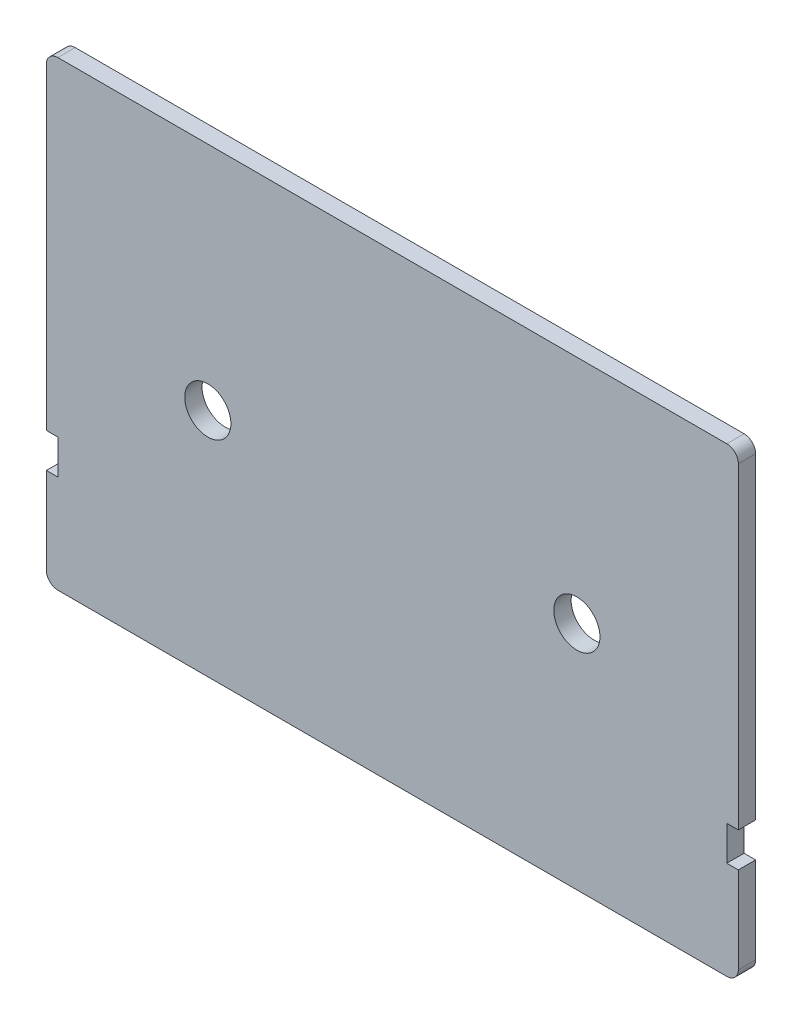
ISO-10303-21;
HEADER;
FILE_DESCRIPTION(('STEP AP214'),'2;1');
FILE_NAME('part.step','',(''),(''),'','','');
FILE_SCHEMA(('AUTOMOTIVE_DESIGN { 1 0 10303 214 1 1 1 1 }'));
ENDSEC;
DATA;
#1=APPLICATION_CONTEXT('core data for automotive mechanical design processes');
#2=APPLICATION_PROTOCOL_DEFINITION('international standard','automotive_design',2000,#1);
#3=PRODUCT_CONTEXT('',#1,'mechanical');
#4=PRODUCT('Part','Part','',(#3));
#5=PRODUCT_RELATED_PRODUCT_CATEGORY('part','',(#4));
#6=PRODUCT_DEFINITION_FORMATION('','',#4);
#7=PRODUCT_DEFINITION_CONTEXT('part definition',#1,'design');
#8=PRODUCT_DEFINITION('design','',#6,#7);
#9=PRODUCT_DEFINITION_SHAPE('','',#8);
#10=(LENGTH_UNIT() NAMED_UNIT(*) SI_UNIT(.MILLI.,.METRE.));
#11=(NAMED_UNIT(*) PLANE_ANGLE_UNIT() SI_UNIT($,.RADIAN.));
#12=(NAMED_UNIT(*) SI_UNIT($,.STERADIAN.) SOLID_ANGLE_UNIT());
#13=UNCERTAINTY_MEASURE_WITH_UNIT(LENGTH_MEASURE(1.E-05),#10,'distance_accuracy_value','');
#14=(GEOMETRIC_REPRESENTATION_CONTEXT(3) GLOBAL_UNCERTAINTY_ASSIGNED_CONTEXT((#13)) GLOBAL_UNIT_ASSIGNED_CONTEXT((#10,
#11,#12)) REPRESENTATION_CONTEXT('',''));
#15=CARTESIAN_POINT('',(0.,0.,0.));
#16=DIRECTION('',(0.,0.,1.));
#17=DIRECTION('',(1.,0.,0.));
#18=AXIS2_PLACEMENT_3D('',#15,#16,#17);
#19=CARTESIAN_POINT('',(30.,-20.,1.5));
#20=DIRECTION('',(-1.,0.,0.));
#21=DIRECTION('',(0.,0.,1.));
#22=AXIS2_PLACEMENT_3D('',#19,#20,#21);
#23=PLANE('',#22);
#24=DIRECTION('',(0.,1.,0.));
#25=VECTOR('',#24,1.);
#26=CARTESIAN_POINT('',(30.,-20.,1.5));
#27=LINE('',#26,#25);
#28=CARTESIAN_POINT('',(30.,-19.,1.5));
#29=VERTEX_POINT('',#28);
#30=CARTESIAN_POINT('',(30.,-11.5,1.5));
#31=VERTEX_POINT('',#30);
#32=EDGE_CURVE('E175',#29,#31,#27,.T.);
#33=ORIENTED_EDGE('',*,*,#32,.F.);
#34=DIRECTION('',(0.,0.,-1.));
#35=VECTOR('',#34,1.);
#36=CARTESIAN_POINT('',(30.,-19.,1.5));
#37=LINE('',#36,#35);
#38=CARTESIAN_POINT('',(30.,-19.,0.));
#39=VERTEX_POINT('',#38);
#40=EDGE_CURVE('E242',#29,#39,#37,.T.);
#41=ORIENTED_EDGE('',*,*,#40,.T.);
#42=DIRECTION('',(0.,1.,0.));
#43=VECTOR('',#42,1.);
#44=CARTESIAN_POINT('',(30.,-20.,0.));
#45=LINE('',#44,#43);
#46=CARTESIAN_POINT('',(30.,-11.5,0.));
#47=VERTEX_POINT('',#46);
#48=EDGE_CURVE('E192',#39,#47,#45,.T.);
#49=ORIENTED_EDGE('',*,*,#48,.T.);
#50=DIRECTION('',(0.,0.,1.));
#51=VECTOR('',#50,1.);
#52=CARTESIAN_POINT('',(30.,-11.5,-8.5));
#53=LINE('',#52,#51);
#54=EDGE_CURVE('E288',#47,#31,#53,.T.);
#55=ORIENTED_EDGE('',*,*,#54,.T.);
#56=EDGE_LOOP('',(#33,#41,#49,#55));
#57=FACE_BOUND('',#56,.T.);
#58=ADVANCED_FACE('F35',(#57),#23,.F.);
#59=CARTESIAN_POINT('',(-30.,-20.,1.5));
#60=DIRECTION('',(1.,0.,0.));
#61=DIRECTION('',(0.,1.,0.));
#62=AXIS2_PLACEMENT_3D('',#59,#60,#61);
#63=PLANE('',#62);
#64=DIRECTION('',(0.,-1.,0.));
#65=VECTOR('',#64,1.);
#66=CARTESIAN_POINT('',(-30.,-20.,1.5));
#67=LINE('',#66,#65);
#68=CARTESIAN_POINT('',(-30.,19.,1.5));
#69=VERTEX_POINT('',#68);
#70=CARTESIAN_POINT('',(-30.,-8.5,1.5));
#71=VERTEX_POINT('',#70);
#72=EDGE_CURVE('E179',#69,#71,#67,.T.);
#73=ORIENTED_EDGE('',*,*,#72,.F.);
#74=DIRECTION('',(0.,0.,-1.));
#75=VECTOR('',#74,1.);
#76=CARTESIAN_POINT('',(-30.,19.,1.5));
#77=LINE('',#76,#75);
#78=CARTESIAN_POINT('',(-30.,19.,0.));
#79=VERTEX_POINT('',#78);
#80=EDGE_CURVE('E11',#69,#79,#77,.T.);
#81=ORIENTED_EDGE('',*,*,#80,.T.);
#82=DIRECTION('',(0.,-1.,0.));
#83=VECTOR('',#82,1.);
#84=CARTESIAN_POINT('',(-30.,-20.,0.));
#85=LINE('',#84,#83);
#86=CARTESIAN_POINT('',(-30.,-8.5,0.));
#87=VERTEX_POINT('',#86);
#88=EDGE_CURVE('E185',#79,#87,#85,.T.);
#89=ORIENTED_EDGE('',*,*,#88,.T.);
#90=DIRECTION('',(0.,0.,1.));
#91=VECTOR('',#90,1.);
#92=CARTESIAN_POINT('',(-30.,-8.5,-8.5));
#93=LINE('',#92,#91);
#94=EDGE_CURVE('E266',#87,#71,#93,.T.);
#95=ORIENTED_EDGE('',*,*,#94,.T.);
#96=EDGE_LOOP('',(#73,#81,#89,#95));
#97=FACE_BOUND('',#96,.T.);
#98=ADVANCED_FACE('F263',(#97),#63,.F.);
#99=CARTESIAN_POINT('',(-30.,-11.5,0.));
#100=VERTEX_POINT('',#99);
#101=CARTESIAN_POINT('',(-30.,-19.,0.));
#102=VERTEX_POINT('',#101);
#103=EDGE_CURVE('E188',#100,#102,#85,.T.);
#104=ORIENTED_EDGE('',*,*,#103,.T.);
#105=DIRECTION('',(0.,0.,-1.));
#106=VECTOR('',#105,1.);
#107=CARTESIAN_POINT('',(-30.,-19.,1.5));
#108=LINE('',#107,#106);
#109=CARTESIAN_POINT('',(-30.,-19.,1.5));
#110=VERTEX_POINT('',#109);
#111=EDGE_CURVE('E234',#102,#110,#108,.F.);
#112=ORIENTED_EDGE('',*,*,#111,.T.);
#113=CARTESIAN_POINT('',(-30.,-11.5,1.5));
#114=VERTEX_POINT('',#113);
#115=EDGE_CURVE('E197',#114,#110,#67,.T.);
#116=ORIENTED_EDGE('',*,*,#115,.F.);
#117=DIRECTION('',(0.,0.,1.));
#118=VECTOR('',#117,1.);
#119=CARTESIAN_POINT('',(-30.,-11.5,-8.5));
#120=LINE('',#119,#118);
#121=EDGE_CURVE('E274',#100,#114,#120,.T.);
#122=ORIENTED_EDGE('',*,*,#121,.F.);
#123=EDGE_LOOP('',(#104,#112,#116,#122));
#124=FACE_BOUND('',#123,.T.);
#125=ADVANCED_FACE('F323',(#124),#63,.F.);
#126=CARTESIAN_POINT('',(30.,-20.,1.5));
#127=DIRECTION('',(0.,1.,0.));
#128=DIRECTION('',(-1.,0.,0.));
#129=AXIS2_PLACEMENT_3D('',#126,#127,#128);
#130=PLANE('',#129);
#131=DIRECTION('',(1.,0.,0.));
#132=VECTOR('',#131,1.);
#133=CARTESIAN_POINT('',(30.,-20.,1.5));
#134=LINE('',#133,#132);
#135=CARTESIAN_POINT('',(-29.,-20.,1.5));
#136=VERTEX_POINT('',#135);
#137=CARTESIAN_POINT('',(29.,-20.,1.5));
#138=VERTEX_POINT('',#137);
#139=EDGE_CURVE('E176',#136,#138,#134,.T.);
#140=ORIENTED_EDGE('',*,*,#139,.F.);
#141=DIRECTION('',(0.,0.,-1.));
#142=VECTOR('',#141,1.);
#143=CARTESIAN_POINT('',(-29.,-20.,1.5));
#144=LINE('',#143,#142);
#145=CARTESIAN_POINT('',(-29.,-20.,0.));
#146=VERTEX_POINT('',#145);
#147=EDGE_CURVE('E223',#136,#146,#144,.T.);
#148=ORIENTED_EDGE('',*,*,#147,.T.);
#149=DIRECTION('',(1.,0.,0.));
#150=VECTOR('',#149,1.);
#151=CARTESIAN_POINT('',(30.,-20.,0.));
#152=LINE('',#151,#150);
#153=CARTESIAN_POINT('',(29.,-20.,0.));
#154=VERTEX_POINT('',#153);
#155=EDGE_CURVE('E187',#146,#154,#152,.T.);
#156=ORIENTED_EDGE('',*,*,#155,.T.);
#157=DIRECTION('',(0.,0.,-1.));
#158=VECTOR('',#157,1.);
#159=CARTESIAN_POINT('',(29.,-20.,1.5));
#160=LINE('',#159,#158);
#161=EDGE_CURVE('E221',#154,#138,#160,.F.);
#162=ORIENTED_EDGE('',*,*,#161,.T.);
#163=EDGE_LOOP('',(#140,#148,#156,#162));
#164=FACE_BOUND('',#163,.T.);
#165=ADVANCED_FACE('F328',(#164),#130,.F.);
#166=CARTESIAN_POINT('',(30.,-8.5,0.));
#167=VERTEX_POINT('',#166);
#168=CARTESIAN_POINT('',(30.,19.,0.));
#169=VERTEX_POINT('',#168);
#170=EDGE_CURVE('E191',#167,#169,#45,.T.);
#171=ORIENTED_EDGE('',*,*,#170,.T.);
#172=DIRECTION('',(0.,0.,-1.));
#173=VECTOR('',#172,1.);
#174=CARTESIAN_POINT('',(30.,19.,1.5));
#175=LINE('',#174,#173);
#176=CARTESIAN_POINT('',(30.,19.,1.5));
#177=VERTEX_POINT('',#176);
#178=EDGE_CURVE('E43',#169,#177,#175,.F.);
#179=ORIENTED_EDGE('',*,*,#178,.T.);
#180=CARTESIAN_POINT('',(30.,-8.5,1.5));
#181=VERTEX_POINT('',#180);
#182=EDGE_CURVE('E167',#181,#177,#27,.T.);
#183=ORIENTED_EDGE('',*,*,#182,.F.);
#184=DIRECTION('',(0.,0.,1.));
#185=VECTOR('',#184,1.);
#186=CARTESIAN_POINT('',(30.,-8.5,-8.5));
#187=LINE('',#186,#185);
#188=EDGE_CURVE('E149',#167,#181,#187,.T.);
#189=ORIENTED_EDGE('',*,*,#188,.F.);
#190=EDGE_LOOP('',(#171,#179,#183,#189));
#191=FACE_BOUND('',#190,.T.);
#192=ADVANCED_FACE('F173',(#191),#23,.F.);
#193=CARTESIAN_POINT('',(30.,20.,1.5));
#194=DIRECTION('',(0.,-1.,0.));
#195=DIRECTION('',(1.,0.,0.));
#196=AXIS2_PLACEMENT_3D('',#193,#194,#195);
#197=PLANE('',#196);
#198=DIRECTION('',(-1.,0.,0.));
#199=VECTOR('',#198,1.);
#200=CARTESIAN_POINT('',(30.,20.,1.5));
#201=LINE('',#200,#199);
#202=CARTESIAN_POINT('',(29.,20.,1.5));
#203=VERTEX_POINT('',#202);
#204=CARTESIAN_POINT('',(-29.,20.,1.5));
#205=VERTEX_POINT('',#204);
#206=EDGE_CURVE('E178',#203,#205,#201,.T.);
#207=ORIENTED_EDGE('',*,*,#206,.F.);
#208=DIRECTION('',(0.,0.,-1.));
#209=VECTOR('',#208,1.);
#210=CARTESIAN_POINT('',(29.,20.,1.5));
#211=LINE('',#210,#209);
#212=CARTESIAN_POINT('',(29.,20.,0.));
#213=VERTEX_POINT('',#212);
#214=EDGE_CURVE('E247',#203,#213,#211,.T.);
#215=ORIENTED_EDGE('',*,*,#214,.T.);
#216=DIRECTION('',(-1.,0.,0.));
#217=VECTOR('',#216,1.);
#218=CARTESIAN_POINT('',(30.,20.,0.));
#219=LINE('',#218,#217);
#220=CARTESIAN_POINT('',(-29.,20.,0.));
#221=VERTEX_POINT('',#220);
#222=EDGE_CURVE('E194',#213,#221,#219,.T.);
#223=ORIENTED_EDGE('',*,*,#222,.T.);
#224=DIRECTION('',(0.,0.,-1.));
#225=VECTOR('',#224,1.);
#226=CARTESIAN_POINT('',(-29.,20.,1.5));
#227=LINE('',#226,#225);
#228=EDGE_CURVE('E245',#221,#205,#227,.F.);
#229=ORIENTED_EDGE('',*,*,#228,.T.);
#230=EDGE_LOOP('',(#207,#215,#223,#229));
#231=FACE_BOUND('',#230,.T.);
#232=ADVANCED_FACE('F253',(#231),#197,.F.);
#233=CARTESIAN_POINT('',(0.,0.,1.5));
#234=DIRECTION('',(0.,0.,1.));
#235=DIRECTION('',(1.,0.,0.));
#236=AXIS2_PLACEMENT_3D('',#233,#234,#235);
#237=PLANE('',#236);
#238=ORIENTED_EDGE('',*,*,#115,.T.);
#239=CARTESIAN_POINT('',(-29.,-19.,1.5));
#240=DIRECTION('',(0.,0.,1.));
#241=DIRECTION('',(1.,0.,0.));
#242=AXIS2_PLACEMENT_3D('',#239,#240,#241);
#243=CIRCLE('',#242,1.);
#244=EDGE_CURVE('E240',#110,#136,#243,.T.);
#245=ORIENTED_EDGE('',*,*,#244,.T.);
#246=ORIENTED_EDGE('',*,*,#139,.T.);
#247=CARTESIAN_POINT('',(29.,-19.,1.5));
#248=DIRECTION('',(0.,0.,1.));
#249=DIRECTION('',(1.,0.,0.));
#250=AXIS2_PLACEMENT_3D('',#247,#248,#249);
#251=CIRCLE('',#250,1.);
#252=EDGE_CURVE('E50',#138,#29,#251,.T.);
#253=ORIENTED_EDGE('',*,*,#252,.T.);
#254=ORIENTED_EDGE('',*,*,#32,.T.);
#255=DIRECTION('',(1.,0.,0.));
#256=VECTOR('',#255,1.);
#257=CARTESIAN_POINT('',(30.,-11.5,1.5));
#258=LINE('',#257,#256);
#259=CARTESIAN_POINT('',(29.,-11.5,1.5));
#260=VERTEX_POINT('',#259);
#261=EDGE_CURVE('E161',#260,#31,#258,.T.);
#262=ORIENTED_EDGE('',*,*,#261,.F.);
#263=DIRECTION('',(0.,-1.,0.));
#264=VECTOR('',#263,1.);
#265=CARTESIAN_POINT('',(29.,-11.5,1.5));
#266=LINE('',#265,#264);
#267=CARTESIAN_POINT('',(29.,-8.5,1.5));
#268=VERTEX_POINT('',#267);
#269=EDGE_CURVE('E171',#268,#260,#266,.T.);
#270=ORIENTED_EDGE('',*,*,#269,.F.);
#271=DIRECTION('',(-1.,0.,0.));
#272=VECTOR('',#271,1.);
#273=CARTESIAN_POINT('',(30.,-8.5,1.5));
#274=LINE('',#273,#272);
#275=EDGE_CURVE('E152',#181,#268,#274,.T.);
#276=ORIENTED_EDGE('',*,*,#275,.F.);
#277=ORIENTED_EDGE('',*,*,#182,.T.);
#278=CARTESIAN_POINT('',(29.,19.,1.5));
#279=DIRECTION('',(0.,0.,1.));
#280=DIRECTION('',(1.,0.,0.));
#281=AXIS2_PLACEMENT_3D('',#278,#279,#280);
#282=CIRCLE('',#281,1.);
#283=EDGE_CURVE('E237',#177,#203,#282,.T.);
#284=ORIENTED_EDGE('',*,*,#283,.T.);
#285=ORIENTED_EDGE('',*,*,#206,.T.);
#286=CARTESIAN_POINT('',(-29.,19.,1.5));
#287=DIRECTION('',(0.,0.,1.));
#288=DIRECTION('',(1.,0.,0.));
#289=AXIS2_PLACEMENT_3D('',#286,#287,#288);
#290=CIRCLE('',#289,1.);
#291=EDGE_CURVE('E57',#205,#69,#290,.T.);
#292=ORIENTED_EDGE('',*,*,#291,.T.);
#293=ORIENTED_EDGE('',*,*,#72,.T.);
#294=DIRECTION('',(-1.,0.,0.));
#295=VECTOR('',#294,1.);
#296=CARTESIAN_POINT('',(-30.,-8.5,1.5));
#297=LINE('',#296,#295);
#298=CARTESIAN_POINT('',(-29.,-8.5,1.5));
#299=VERTEX_POINT('',#298);
#300=EDGE_CURVE('E277',#299,#71,#297,.T.);
#301=ORIENTED_EDGE('',*,*,#300,.F.);
#302=DIRECTION('',(0.,1.,0.));
#303=VECTOR('',#302,1.);
#304=CARTESIAN_POINT('',(-29.,-11.5,1.5));
#305=LINE('',#304,#303);
#306=CARTESIAN_POINT('',(-29.,-11.5,1.5));
#307=VERTEX_POINT('',#306);
#308=EDGE_CURVE('E283',#307,#299,#305,.T.);
#309=ORIENTED_EDGE('',*,*,#308,.F.);
#310=DIRECTION('',(1.,0.,0.));
#311=VECTOR('',#310,1.);
#312=CARTESIAN_POINT('',(-30.,-11.5,1.5));
#313=LINE('',#312,#311);
#314=EDGE_CURVE('E286',#114,#307,#313,.T.);
#315=ORIENTED_EDGE('',*,*,#314,.F.);
#316=EDGE_LOOP('',(#238,#245,#246,#253,#254,#262,#270,#276,#277,#284,#285,#292,#293,#301,#309,#315));
#317=FACE_BOUND('',#316,.T.);
#318=CARTESIAN_POINT('',(16.,0.,1.5));
#319=DIRECTION('',(0.,0.,1.));
#320=DIRECTION('',(1.,0.,0.));
#321=AXIS2_PLACEMENT_3D('',#318,#319,#320);
#322=CIRCLE('',#321,2.);
#323=CARTESIAN_POINT('',(18.,0.,1.5));
#324=VERTEX_POINT('',#323);
#325=EDGE_CURVE('E205',#324,#324,#322,.T.);
#326=ORIENTED_EDGE('',*,*,#325,.F.);
#327=EDGE_LOOP('',(#326));
#328=FACE_BOUND('',#327,.T.);
#329=CARTESIAN_POINT('',(-16.,0.,1.5));
#330=DIRECTION('',(0.,0.,1.));
#331=DIRECTION('',(1.,0.,0.));
#332=AXIS2_PLACEMENT_3D('',#329,#330,#331);
#333=CIRCLE('',#332,2.);
#334=CARTESIAN_POINT('',(-14.,0.,1.5));
#335=VERTEX_POINT('',#334);
#336=EDGE_CURVE('E201',#335,#335,#333,.T.);
#337=ORIENTED_EDGE('',*,*,#336,.F.);
#338=EDGE_LOOP('',(#337));
#339=FACE_BOUND('',#338,.T.);
#340=ADVANCED_FACE('F165',(#317,#328,#339),#237,.T.);
#341=CARTESIAN_POINT('',(0.,0.,0.));
#342=DIRECTION('',(0.,0.,1.));
#343=DIRECTION('',(1.,0.,0.));
#344=AXIS2_PLACEMENT_3D('',#341,#342,#343);
#345=PLANE('',#344);
#346=CARTESIAN_POINT('',(16.,0.,0.));
#347=DIRECTION('',(0.,0.,1.));
#348=DIRECTION('',(1.,0.,0.));
#349=AXIS2_PLACEMENT_3D('',#346,#347,#348);
#350=CIRCLE('',#349,2.);
#351=CARTESIAN_POINT('',(18.,0.,0.));
#352=VERTEX_POINT('',#351);
#353=EDGE_CURVE('E202',#352,#352,#350,.T.);
#354=ORIENTED_EDGE('',*,*,#353,.T.);
#355=EDGE_LOOP('',(#354));
#356=FACE_BOUND('',#355,.T.);
#357=CARTESIAN_POINT('',(-16.,0.,0.));
#358=DIRECTION('',(0.,0.,1.));
#359=DIRECTION('',(1.,0.,0.));
#360=AXIS2_PLACEMENT_3D('',#357,#358,#359);
#361=CIRCLE('',#360,2.);
#362=CARTESIAN_POINT('',(-14.,0.,0.));
#363=VERTEX_POINT('',#362);
#364=EDGE_CURVE('E198',#363,#363,#361,.T.);
#365=ORIENTED_EDGE('',*,*,#364,.T.);
#366=EDGE_LOOP('',(#365));
#367=FACE_BOUND('',#366,.T.);
#368=ORIENTED_EDGE('',*,*,#155,.F.);
#369=CARTESIAN_POINT('',(-29.,-19.,0.));
#370=DIRECTION('',(0.,0.,1.));
#371=DIRECTION('',(1.,0.,0.));
#372=AXIS2_PLACEMENT_3D('',#369,#370,#371);
#373=CIRCLE('',#372,1.);
#374=EDGE_CURVE('E232',#146,#102,#373,.F.);
#375=ORIENTED_EDGE('',*,*,#374,.T.);
#376=ORIENTED_EDGE('',*,*,#103,.F.);
#377=DIRECTION('',(1.,0.,0.));
#378=VECTOR('',#377,1.);
#379=CARTESIAN_POINT('',(0.,-11.5,0.));
#380=LINE('',#379,#378);
#381=CARTESIAN_POINT('',(-29.,-11.5,0.));
#382=VERTEX_POINT('',#381);
#383=EDGE_CURVE('E184',#100,#382,#380,.T.);
#384=ORIENTED_EDGE('',*,*,#383,.T.);
#385=DIRECTION('',(0.,1.,0.));
#386=VECTOR('',#385,1.);
#387=CARTESIAN_POINT('',(-29.,0.,0.));
#388=LINE('',#387,#386);
#389=CARTESIAN_POINT('',(-29.,-8.5,0.));
#390=VERTEX_POINT('',#389);
#391=EDGE_CURVE('E208',#382,#390,#388,.T.);
#392=ORIENTED_EDGE('',*,*,#391,.T.);
#393=DIRECTION('',(-1.,0.,0.));
#394=VECTOR('',#393,1.);
#395=CARTESIAN_POINT('',(0.,-8.5,0.));
#396=LINE('',#395,#394);
#397=EDGE_CURVE('E211',#390,#87,#396,.T.);
#398=ORIENTED_EDGE('',*,*,#397,.T.);
#399=ORIENTED_EDGE('',*,*,#88,.F.);
#400=CARTESIAN_POINT('',(-29.,19.,0.));
#401=DIRECTION('',(0.,0.,1.));
#402=DIRECTION('',(1.,0.,0.));
#403=AXIS2_PLACEMENT_3D('',#400,#401,#402);
#404=CIRCLE('',#403,1.);
#405=EDGE_CURVE('E226',#79,#221,#404,.F.);
#406=ORIENTED_EDGE('',*,*,#405,.T.);
#407=ORIENTED_EDGE('',*,*,#222,.F.);
#408=CARTESIAN_POINT('',(29.,19.,0.));
#409=DIRECTION('',(0.,0.,1.));
#410=DIRECTION('',(1.,0.,0.));
#411=AXIS2_PLACEMENT_3D('',#408,#409,#410);
#412=CIRCLE('',#411,1.);
#413=EDGE_CURVE('E228',#213,#169,#412,.F.);
#414=ORIENTED_EDGE('',*,*,#413,.T.);
#415=ORIENTED_EDGE('',*,*,#170,.F.);
#416=DIRECTION('',(-1.,0.,0.));
#417=VECTOR('',#416,1.);
#418=CARTESIAN_POINT('',(0.,-8.5,0.));
#419=LINE('',#418,#417);
#420=CARTESIAN_POINT('',(29.,-8.5,0.));
#421=VERTEX_POINT('',#420);
#422=EDGE_CURVE('E155',#167,#421,#419,.T.);
#423=ORIENTED_EDGE('',*,*,#422,.T.);
#424=DIRECTION('',(0.,-1.,0.));
#425=VECTOR('',#424,1.);
#426=CARTESIAN_POINT('',(29.,0.,0.));
#427=LINE('',#426,#425);
#428=CARTESIAN_POINT('',(29.,-11.5,0.));
#429=VERTEX_POINT('',#428);
#430=EDGE_CURVE('E215',#421,#429,#427,.T.);
#431=ORIENTED_EDGE('',*,*,#430,.T.);
#432=DIRECTION('',(1.,0.,0.));
#433=VECTOR('',#432,1.);
#434=CARTESIAN_POINT('',(0.,-11.5000000000001,0.));
#435=LINE('',#434,#433);
#436=EDGE_CURVE('E218',#429,#47,#435,.T.);
#437=ORIENTED_EDGE('',*,*,#436,.T.);
#438=ORIENTED_EDGE('',*,*,#48,.F.);
#439=CARTESIAN_POINT('',(29.,-19.,0.));
#440=DIRECTION('',(0.,0.,1.));
#441=DIRECTION('',(1.,0.,0.));
#442=AXIS2_PLACEMENT_3D('',#439,#440,#441);
#443=CIRCLE('',#442,1.);
#444=EDGE_CURVE('E230',#39,#154,#443,.F.);
#445=ORIENTED_EDGE('',*,*,#444,.T.);
#446=EDGE_LOOP('',(#368,#375,#376,#384,#392,#398,#399,#406,#407,#414,#415,#423,#431,#437,#438,#445));
#447=FACE_BOUND('',#446,.T.);
#448=ADVANCED_FACE('F258',(#356,#367,#447),#345,.F.);
#449=CARTESIAN_POINT('',(-16.,0.,-8.5));
#450=DIRECTION('',(0.,0.,1.));
#451=DIRECTION('',(1.,0.,0.));
#452=AXIS2_PLACEMENT_3D('',#449,#450,#451);
#453=CYLINDRICAL_SURFACE('',#452,2.);
#454=ORIENTED_EDGE('',*,*,#336,.T.);
#455=EDGE_LOOP('',(#454));
#456=FACE_BOUND('',#455,.T.);
#457=ORIENTED_EDGE('',*,*,#364,.F.);
#458=EDGE_LOOP('',(#457));
#459=FACE_BOUND('',#458,.T.);
#460=ADVANCED_FACE('F372',(#456,#459),#453,.F.);
#461=CARTESIAN_POINT('',(16.,0.,-8.5));
#462=DIRECTION('',(0.,0.,1.));
#463=DIRECTION('',(1.,0.,0.));
#464=AXIS2_PLACEMENT_3D('',#461,#462,#463);
#465=CYLINDRICAL_SURFACE('',#464,2.);
#466=ORIENTED_EDGE('',*,*,#325,.T.);
#467=EDGE_LOOP('',(#466));
#468=FACE_BOUND('',#467,.T.);
#469=ORIENTED_EDGE('',*,*,#353,.F.);
#470=EDGE_LOOP('',(#469));
#471=FACE_BOUND('',#470,.T.);
#472=ADVANCED_FACE('F365',(#468,#471),#465,.F.);
#473=CARTESIAN_POINT('',(-30.,-8.5,-8.5));
#474=DIRECTION('',(0.,1.,0.));
#475=DIRECTION('',(0.,0.,1.));
#476=AXIS2_PLACEMENT_3D('',#473,#474,#475);
#477=PLANE('',#476);
#478=DIRECTION('',(0.,0.,1.));
#479=VECTOR('',#478,1.);
#480=CARTESIAN_POINT('',(-29.,-8.5,-8.5));
#481=LINE('',#480,#479);
#482=EDGE_CURVE('E279',#390,#299,#481,.T.);
#483=ORIENTED_EDGE('',*,*,#482,.T.);
#484=ORIENTED_EDGE('',*,*,#300,.T.);
#485=ORIENTED_EDGE('',*,*,#94,.F.);
#486=ORIENTED_EDGE('',*,*,#397,.F.);
#487=EDGE_LOOP('',(#483,#484,#485,#486));
#488=FACE_BOUND('',#487,.T.);
#489=ADVANCED_FACE('F363',(#488),#477,.F.);
#490=CARTESIAN_POINT('',(-29.,-11.5,-8.5));
#491=DIRECTION('',(1.,0.,0.));
#492=DIRECTION('',(0.,1.,0.));
#493=AXIS2_PLACEMENT_3D('',#490,#491,#492);
#494=PLANE('',#493);
#495=DIRECTION('',(0.,0.,1.));
#496=VECTOR('',#495,1.);
#497=CARTESIAN_POINT('',(-29.,-11.5,-8.5));
#498=LINE('',#497,#496);
#499=EDGE_CURVE('E276',#382,#307,#498,.T.);
#500=ORIENTED_EDGE('',*,*,#499,.T.);
#501=ORIENTED_EDGE('',*,*,#308,.T.);
#502=ORIENTED_EDGE('',*,*,#482,.F.);
#503=ORIENTED_EDGE('',*,*,#391,.F.);
#504=EDGE_LOOP('',(#500,#501,#502,#503));
#505=FACE_BOUND('',#504,.T.);
#506=ADVANCED_FACE('F360',(#505),#494,.F.);
#507=CARTESIAN_POINT('',(-30.,-11.5,-8.5));
#508=DIRECTION('',(0.,-1.,0.));
#509=DIRECTION('',(0.,0.,-1.));
#510=AXIS2_PLACEMENT_3D('',#507,#508,#509);
#511=PLANE('',#510);
#512=ORIENTED_EDGE('',*,*,#121,.T.);
#513=ORIENTED_EDGE('',*,*,#314,.T.);
#514=ORIENTED_EDGE('',*,*,#499,.F.);
#515=ORIENTED_EDGE('',*,*,#383,.F.);
#516=EDGE_LOOP('',(#512,#513,#514,#515));
#517=FACE_BOUND('',#516,.T.);
#518=ADVANCED_FACE('F356',(#517),#511,.F.);
#519=CARTESIAN_POINT('',(30.,-11.5,-8.5));
#520=DIRECTION('',(0.,-1.,0.));
#521=DIRECTION('',(1.,0.,0.));
#522=AXIS2_PLACEMENT_3D('',#519,#520,#521);
#523=PLANE('',#522);
#524=DIRECTION('',(0.,0.,1.));
#525=VECTOR('',#524,1.);
#526=CARTESIAN_POINT('',(29.,-11.5,-8.5));
#527=LINE('',#526,#525);
#528=EDGE_CURVE('E291',#429,#260,#527,.T.);
#529=ORIENTED_EDGE('',*,*,#528,.T.);
#530=ORIENTED_EDGE('',*,*,#261,.T.);
#531=ORIENTED_EDGE('',*,*,#54,.F.);
#532=ORIENTED_EDGE('',*,*,#436,.F.);
#533=EDGE_LOOP('',(#529,#530,#531,#532));
#534=FACE_BOUND('',#533,.T.);
#535=ADVANCED_FACE('F303',(#534),#523,.F.);
#536=CARTESIAN_POINT('',(29.,-11.5,-8.5));
#537=DIRECTION('',(-1.,0.,0.));
#538=DIRECTION('',(0.,0.,1.));
#539=AXIS2_PLACEMENT_3D('',#536,#537,#538);
#540=PLANE('',#539);
#541=DIRECTION('',(0.,0.,1.));
#542=VECTOR('',#541,1.);
#543=CARTESIAN_POINT('',(29.,-8.5,-8.5));
#544=LINE('',#543,#542);
#545=EDGE_CURVE('E160',#421,#268,#544,.T.);
#546=ORIENTED_EDGE('',*,*,#545,.T.);
#547=ORIENTED_EDGE('',*,*,#269,.T.);
#548=ORIENTED_EDGE('',*,*,#528,.F.);
#549=ORIENTED_EDGE('',*,*,#430,.F.);
#550=EDGE_LOOP('',(#546,#547,#548,#549));
#551=FACE_BOUND('',#550,.T.);
#552=ADVANCED_FACE('F299',(#551),#540,.F.);
#553=CARTESIAN_POINT('',(30.,-8.5,-8.5));
#554=DIRECTION('',(0.,1.,0.));
#555=DIRECTION('',(0.,0.,1.));
#556=AXIS2_PLACEMENT_3D('',#553,#554,#555);
#557=PLANE('',#556);
#558=ORIENTED_EDGE('',*,*,#188,.T.);
#559=ORIENTED_EDGE('',*,*,#275,.T.);
#560=ORIENTED_EDGE('',*,*,#545,.F.);
#561=ORIENTED_EDGE('',*,*,#422,.F.);
#562=EDGE_LOOP('',(#558,#559,#560,#561));
#563=FACE_BOUND('',#562,.T.);
#564=ADVANCED_FACE('F151',(#563),#557,.F.);
#565=CARTESIAN_POINT('',(-29.,-19.,1.5));
#566=DIRECTION('',(0.,0.,-1.));
#567=DIRECTION('',(-1.,0.,0.));
#568=AXIS2_PLACEMENT_3D('',#565,#566,#567);
#569=CYLINDRICAL_SURFACE('',#568,1.);
#570=ORIENTED_EDGE('',*,*,#244,.F.);
#571=ORIENTED_EDGE('',*,*,#111,.F.);
#572=ORIENTED_EDGE('',*,*,#374,.F.);
#573=ORIENTED_EDGE('',*,*,#147,.F.);
#574=EDGE_LOOP('',(#570,#571,#572,#573));
#575=FACE_BOUND('',#574,.T.);
#576=ADVANCED_FACE('F314',(#575),#569,.T.);
#577=CARTESIAN_POINT('',(29.,-19.,1.5));
#578=DIRECTION('',(0.,0.,-1.));
#579=DIRECTION('',(-1.,0.,0.));
#580=AXIS2_PLACEMENT_3D('',#577,#578,#579);
#581=CYLINDRICAL_SURFACE('',#580,1.);
#582=ORIENTED_EDGE('',*,*,#252,.F.);
#583=ORIENTED_EDGE('',*,*,#161,.F.);
#584=ORIENTED_EDGE('',*,*,#444,.F.);
#585=ORIENTED_EDGE('',*,*,#40,.F.);
#586=EDGE_LOOP('',(#582,#583,#584,#585));
#587=FACE_BOUND('',#586,.T.);
#588=ADVANCED_FACE('F309',(#587),#581,.T.);
#589=CARTESIAN_POINT('',(29.,19.,1.5));
#590=DIRECTION('',(0.,0.,-1.));
#591=DIRECTION('',(-1.,0.,0.));
#592=AXIS2_PLACEMENT_3D('',#589,#590,#591);
#593=CYLINDRICAL_SURFACE('',#592,1.);
#594=ORIENTED_EDGE('',*,*,#283,.F.);
#595=ORIENTED_EDGE('',*,*,#178,.F.);
#596=ORIENTED_EDGE('',*,*,#413,.F.);
#597=ORIENTED_EDGE('',*,*,#214,.F.);
#598=EDGE_LOOP('',(#594,#595,#596,#597));
#599=FACE_BOUND('',#598,.T.);
#600=ADVANCED_FACE('F307',(#599),#593,.T.);
#601=CARTESIAN_POINT('',(-29.,19.,1.5));
#602=DIRECTION('',(0.,0.,-1.));
#603=DIRECTION('',(-1.,0.,0.));
#604=AXIS2_PLACEMENT_3D('',#601,#602,#603);
#605=CYLINDRICAL_SURFACE('',#604,1.);
#606=ORIENTED_EDGE('',*,*,#291,.F.);
#607=ORIENTED_EDGE('',*,*,#228,.F.);
#608=ORIENTED_EDGE('',*,*,#405,.F.);
#609=ORIENTED_EDGE('',*,*,#80,.F.);
#610=EDGE_LOOP('',(#606,#607,#608,#609));
#611=FACE_BOUND('',#610,.T.);
#612=ADVANCED_FACE('F37',(#611),#605,.T.);
#613=CLOSED_SHELL('',(#58,#98,#125,#165,#192,#232,#340,#448,#460,#472,#489,#506,#518,#535,#552,
#564,#576,#588,#600,#612));
#614=MANIFOLD_SOLID_BREP('B2',#613);
#615=ADVANCED_BREP_SHAPE_REPRESENTATION('',(#18,#614),#14);
#616=SHAPE_DEFINITION_REPRESENTATION(#9,#615);
ENDSEC;
END-ISO-10303-21;
